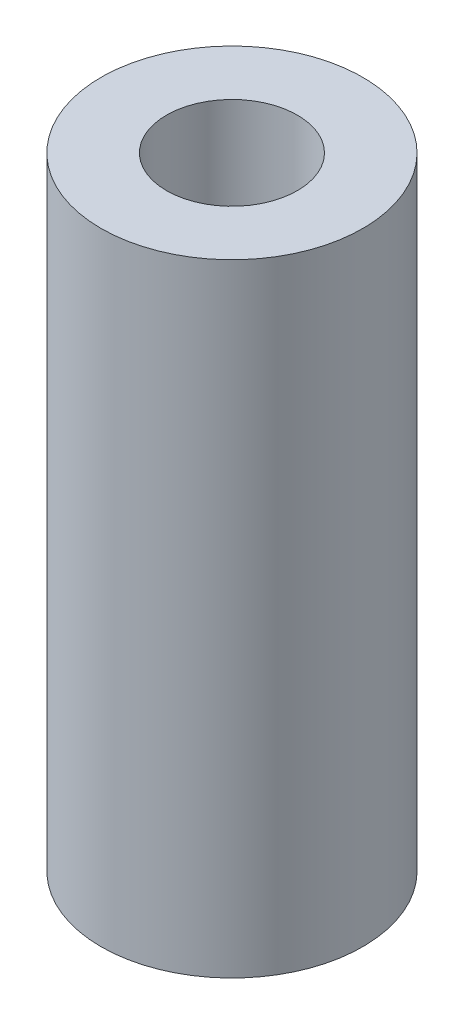
ISO-10303-21;
HEADER;
FILE_DESCRIPTION(('STEP AP214'),'2;1');
FILE_NAME('part.step','',(''),(''),'','','');
FILE_SCHEMA(('AUTOMOTIVE_DESIGN { 1 0 10303 214 1 1 1 1 }'));
ENDSEC;
DATA;
#1=APPLICATION_CONTEXT('core data for automotive mechanical design processes');
#2=APPLICATION_PROTOCOL_DEFINITION('international standard','automotive_design',2000,#1);
#3=PRODUCT_CONTEXT('',#1,'mechanical');
#4=PRODUCT('Part','Part','',(#3));
#5=PRODUCT_RELATED_PRODUCT_CATEGORY('part','',(#4));
#6=PRODUCT_DEFINITION_FORMATION('','',#4);
#7=PRODUCT_DEFINITION_CONTEXT('part definition',#1,'design');
#8=PRODUCT_DEFINITION('design','',#6,#7);
#9=PRODUCT_DEFINITION_SHAPE('','',#8);
#10=(LENGTH_UNIT() NAMED_UNIT(*) SI_UNIT(.MILLI.,.METRE.));
#11=(NAMED_UNIT(*) PLANE_ANGLE_UNIT() SI_UNIT($,.RADIAN.));
#12=(NAMED_UNIT(*) SI_UNIT($,.STERADIAN.) SOLID_ANGLE_UNIT());
#13=UNCERTAINTY_MEASURE_WITH_UNIT(LENGTH_MEASURE(1.E-05),#10,'distance_accuracy_value','');
#14=(GEOMETRIC_REPRESENTATION_CONTEXT(3) GLOBAL_UNCERTAINTY_ASSIGNED_CONTEXT((#13)) GLOBAL_UNIT_ASSIGNED_CONTEXT((#10,
#11,#12)) REPRESENTATION_CONTEXT('',''));
#15=CARTESIAN_POINT('',(0.,0.,0.));
#16=DIRECTION('',(0.,0.,1.));
#17=DIRECTION('',(1.,0.,0.));
#18=AXIS2_PLACEMENT_3D('',#15,#16,#17);
#19=CARTESIAN_POINT('',(0.,30.1752,0.));
#20=DIRECTION('',(0.,1.,0.));
#21=DIRECTION('',(0.,0.,1.));
#22=AXIS2_PLACEMENT_3D('',#19,#20,#21);
#23=PLANE('',#22);
#24=CARTESIAN_POINT('',(0.,30.1752,0.));
#25=DIRECTION('',(0.,1.,0.));
#26=DIRECTION('',(0.,0.,1.));
#27=AXIS2_PLACEMENT_3D('',#24,#25,#26);
#28=CIRCLE('',#27,6.35);
#29=CARTESIAN_POINT('',(0.,30.1752,6.35));
#30=VERTEX_POINT('',#29);
#31=EDGE_CURVE('E10',#30,#30,#28,.T.);
#32=ORIENTED_EDGE('',*,*,#31,.T.);
#33=EDGE_LOOP('',(#32));
#34=FACE_BOUND('',#33,.T.);
#35=CARTESIAN_POINT('',(0.,30.1752,0.));
#36=DIRECTION('',(0.,1.,0.));
#37=DIRECTION('',(0.,0.,1.));
#38=AXIS2_PLACEMENT_3D('',#35,#36,#37);
#39=CIRCLE('',#38,3.175);
#40=CARTESIAN_POINT('',(0.,30.1752,3.175));
#41=VERTEX_POINT('',#40);
#42=EDGE_CURVE('E43',#41,#41,#39,.T.);
#43=ORIENTED_EDGE('',*,*,#42,.F.);
#44=EDGE_LOOP('',(#43));
#45=FACE_BOUND('',#44,.T.);
#46=ADVANCED_FACE('F32',(#34,#45),#23,.T.);
#47=CARTESIAN_POINT('',(0.,0.,0.));
#48=DIRECTION('',(0.,1.,0.));
#49=DIRECTION('',(0.,0.,1.));
#50=AXIS2_PLACEMENT_3D('',#47,#48,#49);
#51=PLANE('',#50);
#52=CARTESIAN_POINT('',(0.,0.,0.));
#53=DIRECTION('',(0.,1.,0.));
#54=DIRECTION('',(0.,0.,1.));
#55=AXIS2_PLACEMENT_3D('',#52,#53,#54);
#56=CIRCLE('',#55,6.35);
#57=CARTESIAN_POINT('',(0.,0.,6.35));
#58=VERTEX_POINT('',#57);
#59=EDGE_CURVE('E36',#58,#58,#56,.T.);
#60=ORIENTED_EDGE('',*,*,#59,.F.);
#61=EDGE_LOOP('',(#60));
#62=FACE_BOUND('',#61,.T.);
#63=CARTESIAN_POINT('',(0.,0.,0.));
#64=DIRECTION('',(0.,1.,0.));
#65=DIRECTION('',(0.,0.,1.));
#66=AXIS2_PLACEMENT_3D('',#63,#64,#65);
#67=CIRCLE('',#66,3.175);
#68=CARTESIAN_POINT('',(0.,0.,3.175));
#69=VERTEX_POINT('',#68);
#70=EDGE_CURVE('E45',#69,#69,#67,.T.);
#71=ORIENTED_EDGE('',*,*,#70,.T.);
#72=EDGE_LOOP('',(#71));
#73=FACE_BOUND('',#72,.T.);
#74=ADVANCED_FACE('F55',(#62,#73),#51,.F.);
#75=CARTESIAN_POINT('',(0.,30.1752,0.));
#76=DIRECTION('',(0.,-1.,0.));
#77=DIRECTION('',(0.,0.,-1.));
#78=AXIS2_PLACEMENT_3D('',#75,#76,#77);
#79=CYLINDRICAL_SURFACE('',#78,6.35);
#80=ORIENTED_EDGE('',*,*,#31,.F.);
#81=EDGE_LOOP('',(#80));
#82=FACE_BOUND('',#81,.T.);
#83=ORIENTED_EDGE('',*,*,#59,.T.);
#84=EDGE_LOOP('',(#83));
#85=FACE_BOUND('',#84,.T.);
#86=ADVANCED_FACE('F34',(#82,#85),#79,.T.);
#87=CARTESIAN_POINT('',(0.,30.1752,0.));
#88=DIRECTION('',(0.,-1.,0.));
#89=DIRECTION('',(0.,0.,-1.));
#90=AXIS2_PLACEMENT_3D('',#87,#88,#89);
#91=CYLINDRICAL_SURFACE('',#90,3.175);
#92=ORIENTED_EDGE('',*,*,#42,.T.);
#93=EDGE_LOOP('',(#92));
#94=FACE_BOUND('',#93,.T.);
#95=ORIENTED_EDGE('',*,*,#70,.F.);
#96=EDGE_LOOP('',(#95));
#97=FACE_BOUND('',#96,.T.);
#98=ADVANCED_FACE('F51',(#94,#97),#91,.F.);
#99=CLOSED_SHELL('',(#46,#74,#86,#98));
#100=MANIFOLD_SOLID_BREP('B2',#99);
#101=ADVANCED_BREP_SHAPE_REPRESENTATION('',(#18,#100),#14);
#102=SHAPE_DEFINITION_REPRESENTATION(#9,#101);
ENDSEC;
END-ISO-10303-21;
